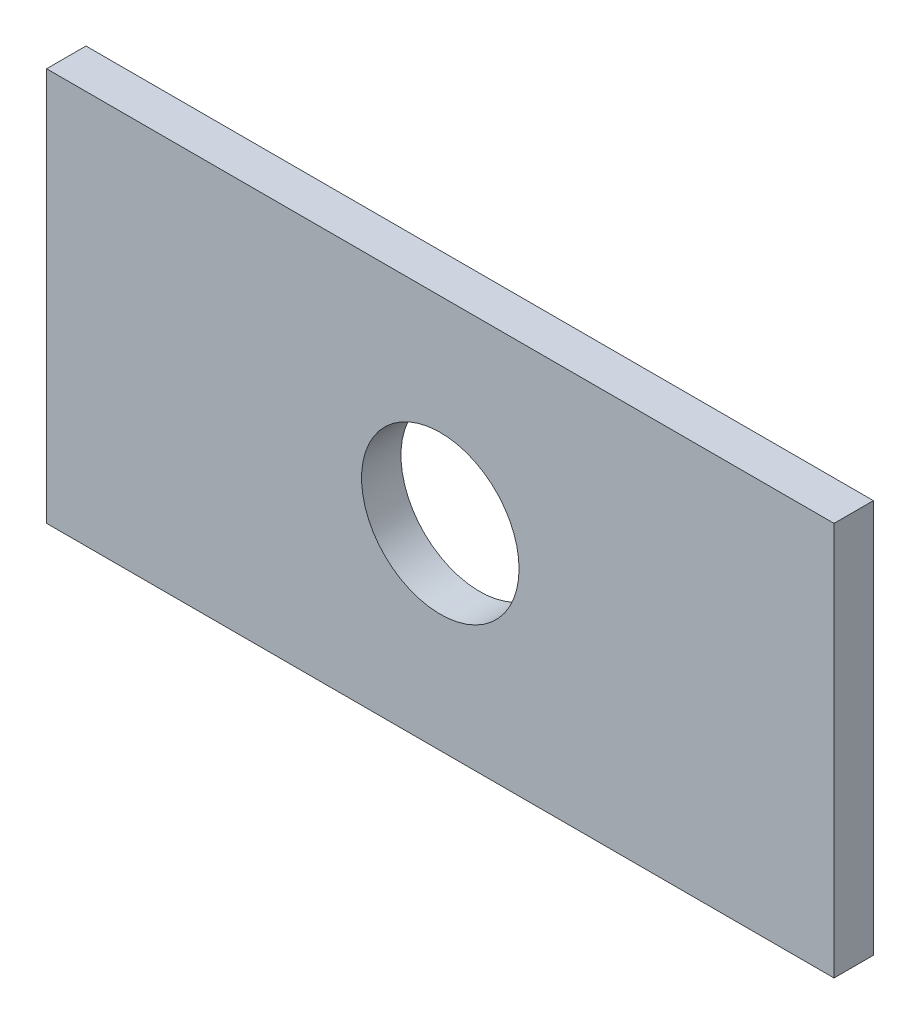
ISO-10303-21;
HEADER;
FILE_DESCRIPTION(('STEP AP214'),'2;1');
FILE_NAME('part.step','',(''),(''),'','','');
FILE_SCHEMA(('AUTOMOTIVE_DESIGN { 1 0 10303 214 1 1 1 1 }'));
ENDSEC;
DATA;
#1=APPLICATION_CONTEXT('core data for automotive mechanical design processes');
#2=APPLICATION_PROTOCOL_DEFINITION('international standard','automotive_design',2000,#1);
#3=PRODUCT_CONTEXT('',#1,'mechanical');
#4=PRODUCT('Part','Part','',(#3));
#5=PRODUCT_RELATED_PRODUCT_CATEGORY('part','',(#4));
#6=PRODUCT_DEFINITION_FORMATION('','',#4);
#7=PRODUCT_DEFINITION_CONTEXT('part definition',#1,'design');
#8=PRODUCT_DEFINITION('design','',#6,#7);
#9=PRODUCT_DEFINITION_SHAPE('','',#8);
#10=(LENGTH_UNIT() NAMED_UNIT(*) SI_UNIT(.MILLI.,.METRE.));
#11=(NAMED_UNIT(*) PLANE_ANGLE_UNIT() SI_UNIT($,.RADIAN.));
#12=(NAMED_UNIT(*) SI_UNIT($,.STERADIAN.) SOLID_ANGLE_UNIT());
#13=UNCERTAINTY_MEASURE_WITH_UNIT(LENGTH_MEASURE(1.E-05),#10,'distance_accuracy_value','');
#14=(GEOMETRIC_REPRESENTATION_CONTEXT(3) GLOBAL_UNCERTAINTY_ASSIGNED_CONTEXT((#13)) GLOBAL_UNIT_ASSIGNED_CONTEXT((#10,
#11,#12)) REPRESENTATION_CONTEXT('',''));
#15=CARTESIAN_POINT('',(0.,0.,0.));
#16=DIRECTION('',(0.,0.,1.));
#17=DIRECTION('',(1.,0.,0.));
#18=AXIS2_PLACEMENT_3D('',#15,#16,#17);
#19=CARTESIAN_POINT('',(0.,0.,-1.));
#20=DIRECTION('',(-1.,0.,0.));
#21=DIRECTION('',(0.,0.,1.));
#22=AXIS2_PLACEMENT_3D('',#19,#20,#21);
#23=PLANE('',#22);
#24=DIRECTION('',(0.,-1.,0.));
#25=VECTOR('',#24,1.);
#26=CARTESIAN_POINT('',(0.,0.,0.));
#27=LINE('',#26,#25);
#28=CARTESIAN_POINT('',(0.,10.,0.));
#29=VERTEX_POINT('',#28);
#30=CARTESIAN_POINT('',(0.,0.,0.));
#31=VERTEX_POINT('',#30);
#32=EDGE_CURVE('E109',#29,#31,#27,.T.);
#33=ORIENTED_EDGE('',*,*,#32,.F.);
#34=DIRECTION('',(0.,0.,1.));
#35=VECTOR('',#34,1.);
#36=CARTESIAN_POINT('',(0.,10.,-1.));
#37=LINE('',#36,#35);
#38=CARTESIAN_POINT('',(0.,10.,-1.));
#39=VERTEX_POINT('',#38);
#40=EDGE_CURVE('E11',#39,#29,#37,.T.);
#41=ORIENTED_EDGE('',*,*,#40,.F.);
#42=DIRECTION('',(0.,-1.,0.));
#43=VECTOR('',#42,1.);
#44=CARTESIAN_POINT('',(0.,0.,-1.));
#45=LINE('',#44,#43);
#46=CARTESIAN_POINT('',(0.,0.,-1.));
#47=VERTEX_POINT('',#46);
#48=EDGE_CURVE('E103',#39,#47,#45,.T.);
#49=ORIENTED_EDGE('',*,*,#48,.T.);
#50=DIRECTION('',(0.,0.,1.));
#51=VECTOR('',#50,1.);
#52=CARTESIAN_POINT('',(0.,0.,-1.));
#53=LINE('',#52,#51);
#54=EDGE_CURVE('E48',#47,#31,#53,.T.);
#55=ORIENTED_EDGE('',*,*,#54,.T.);
#56=EDGE_LOOP('',(#33,#41,#49,#55));
#57=FACE_BOUND('',#56,.T.);
#58=ADVANCED_FACE('F44',(#57),#23,.T.);
#59=CARTESIAN_POINT('',(0.,10.,-1.));
#60=DIRECTION('',(0.,1.,0.));
#61=DIRECTION('',(0.,0.,1.));
#62=AXIS2_PLACEMENT_3D('',#59,#60,#61);
#63=PLANE('',#62);
#64=DIRECTION('',(-1.,0.,0.));
#65=VECTOR('',#64,1.);
#66=CARTESIAN_POINT('',(0.,10.,0.));
#67=LINE('',#66,#65);
#68=CARTESIAN_POINT('',(20.,10.,0.));
#69=VERTEX_POINT('',#68);
#70=EDGE_CURVE('E104',#69,#29,#67,.T.);
#71=ORIENTED_EDGE('',*,*,#70,.F.);
#72=DIRECTION('',(0.,0.,1.));
#73=VECTOR('',#72,1.);
#74=CARTESIAN_POINT('',(20.,10.,-1.));
#75=LINE('',#74,#73);
#76=CARTESIAN_POINT('',(20.,10.,-1.));
#77=VERTEX_POINT('',#76);
#78=EDGE_CURVE('E53',#77,#69,#75,.T.);
#79=ORIENTED_EDGE('',*,*,#78,.F.);
#80=DIRECTION('',(-1.,0.,0.));
#81=VECTOR('',#80,1.);
#82=CARTESIAN_POINT('',(0.,10.,-1.));
#83=LINE('',#82,#81);
#84=EDGE_CURVE('E99',#77,#39,#83,.T.);
#85=ORIENTED_EDGE('',*,*,#84,.T.);
#86=ORIENTED_EDGE('',*,*,#40,.T.);
#87=EDGE_LOOP('',(#71,#79,#85,#86));
#88=FACE_BOUND('',#87,.T.);
#89=ADVANCED_FACE('F122',(#88),#63,.T.);
#90=CARTESIAN_POINT('',(20.,0.,-1.));
#91=DIRECTION('',(1.,0.,0.));
#92=DIRECTION('',(0.,0.,-1.));
#93=AXIS2_PLACEMENT_3D('',#90,#91,#92);
#94=PLANE('',#93);
#95=DIRECTION('',(0.,1.,0.));
#96=VECTOR('',#95,1.);
#97=CARTESIAN_POINT('',(20.,0.,0.));
#98=LINE('',#97,#96);
#99=CARTESIAN_POINT('',(20.,0.,0.));
#100=VERTEX_POINT('',#99);
#101=EDGE_CURVE('E92',#100,#69,#98,.T.);
#102=ORIENTED_EDGE('',*,*,#101,.F.);
#103=DIRECTION('',(0.,0.,1.));
#104=VECTOR('',#103,1.);
#105=CARTESIAN_POINT('',(20.,0.,-1.));
#106=LINE('',#105,#104);
#107=CARTESIAN_POINT('',(20.,0.,-1.));
#108=VERTEX_POINT('',#107);
#109=EDGE_CURVE('E89',#108,#100,#106,.T.);
#110=ORIENTED_EDGE('',*,*,#109,.F.);
#111=DIRECTION('',(0.,1.,0.));
#112=VECTOR('',#111,1.);
#113=CARTESIAN_POINT('',(20.,0.,-1.));
#114=LINE('',#113,#112);
#115=EDGE_CURVE('E91',#108,#77,#114,.T.);
#116=ORIENTED_EDGE('',*,*,#115,.T.);
#117=ORIENTED_EDGE('',*,*,#78,.T.);
#118=EDGE_LOOP('',(#102,#110,#116,#117));
#119=FACE_BOUND('',#118,.T.);
#120=ADVANCED_FACE('F95',(#119),#94,.T.);
#121=CARTESIAN_POINT('',(0.,0.,-1.));
#122=DIRECTION('',(0.,-1.,0.));
#123=DIRECTION('',(0.,0.,-1.));
#124=AXIS2_PLACEMENT_3D('',#121,#122,#123);
#125=PLANE('',#124);
#126=DIRECTION('',(1.,0.,0.));
#127=VECTOR('',#126,1.);
#128=CARTESIAN_POINT('',(0.,0.,0.));
#129=LINE('',#128,#127);
#130=EDGE_CURVE('E114',#31,#100,#129,.T.);
#131=ORIENTED_EDGE('',*,*,#130,.F.);
#132=ORIENTED_EDGE('',*,*,#54,.F.);
#133=DIRECTION('',(1.,0.,0.));
#134=VECTOR('',#133,1.);
#135=CARTESIAN_POINT('',(0.,0.,-1.));
#136=LINE('',#135,#134);
#137=EDGE_CURVE('E97',#47,#108,#136,.T.);
#138=ORIENTED_EDGE('',*,*,#137,.T.);
#139=ORIENTED_EDGE('',*,*,#109,.T.);
#140=EDGE_LOOP('',(#131,#132,#138,#139));
#141=FACE_BOUND('',#140,.T.);
#142=ADVANCED_FACE('F105',(#141),#125,.T.);
#143=CARTESIAN_POINT('',(0.,0.,-1.));
#144=DIRECTION('',(0.,0.,-1.));
#145=DIRECTION('',(-1.,0.,0.));
#146=AXIS2_PLACEMENT_3D('',#143,#144,#145);
#147=PLANE('',#146);
#148=CARTESIAN_POINT('',(10.,5.,-1.));
#149=DIRECTION('',(0.,0.,1.));
#150=DIRECTION('',(1.,0.,0.));
#151=AXIS2_PLACEMENT_3D('',#148,#149,#150);
#152=CIRCLE('',#151,2.);
#153=CARTESIAN_POINT('',(12.,5.,-1.));
#154=VERTEX_POINT('',#153);
#155=EDGE_CURVE('E111',#154,#154,#152,.T.);
#156=ORIENTED_EDGE('',*,*,#155,.T.);
#157=EDGE_LOOP('',(#156));
#158=FACE_BOUND('',#157,.T.);
#159=ORIENTED_EDGE('',*,*,#48,.F.);
#160=ORIENTED_EDGE('',*,*,#84,.F.);
#161=ORIENTED_EDGE('',*,*,#115,.F.);
#162=ORIENTED_EDGE('',*,*,#137,.F.);
#163=EDGE_LOOP('',(#159,#160,#161,#162));
#164=FACE_BOUND('',#163,.T.);
#165=ADVANCED_FACE('F98',(#158,#164),#147,.T.);
#166=CARTESIAN_POINT('',(0.,0.,0.));
#167=DIRECTION('',(0.,0.,-1.));
#168=DIRECTION('',(-1.,0.,0.));
#169=AXIS2_PLACEMENT_3D('',#166,#167,#168);
#170=PLANE('',#169);
#171=CARTESIAN_POINT('',(10.,5.,0.));
#172=DIRECTION('',(0.,0.,1.));
#173=DIRECTION('',(1.,0.,0.));
#174=AXIS2_PLACEMENT_3D('',#171,#172,#173);
#175=CIRCLE('',#174,2.);
#176=CARTESIAN_POINT('',(12.,5.,0.));
#177=VERTEX_POINT('',#176);
#178=EDGE_CURVE('E151',#177,#177,#175,.T.);
#179=ORIENTED_EDGE('',*,*,#178,.F.);
#180=EDGE_LOOP('',(#179));
#181=FACE_BOUND('',#180,.T.);
#182=ORIENTED_EDGE('',*,*,#32,.T.);
#183=ORIENTED_EDGE('',*,*,#130,.T.);
#184=ORIENTED_EDGE('',*,*,#101,.T.);
#185=ORIENTED_EDGE('',*,*,#70,.T.);
#186=EDGE_LOOP('',(#182,#183,#184,#185));
#187=FACE_BOUND('',#186,.T.);
#188=ADVANCED_FACE('F120',(#181,#187),#170,.F.);
#189=CARTESIAN_POINT('',(10.,5.,-1.));
#190=DIRECTION('',(0.,0.,1.));
#191=DIRECTION('',(1.,0.,0.));
#192=AXIS2_PLACEMENT_3D('',#189,#190,#191);
#193=CYLINDRICAL_SURFACE('',#192,2.);
#194=ORIENTED_EDGE('',*,*,#155,.F.);
#195=EDGE_LOOP('',(#194));
#196=FACE_BOUND('',#195,.T.);
#197=ORIENTED_EDGE('',*,*,#178,.T.);
#198=EDGE_LOOP('',(#197));
#199=FACE_BOUND('',#198,.T.);
#200=ADVANCED_FACE('F136',(#196,#199),#193,.F.);
#201=CLOSED_SHELL('',(#58,#89,#120,#142,#165,#188,#200));
#202=MANIFOLD_SOLID_BREP('B2',#201);
#203=ADVANCED_BREP_SHAPE_REPRESENTATION('',(#18,#202),#14);
#204=SHAPE_DEFINITION_REPRESENTATION(#9,#203);
ENDSEC;
END-ISO-10303-21;
